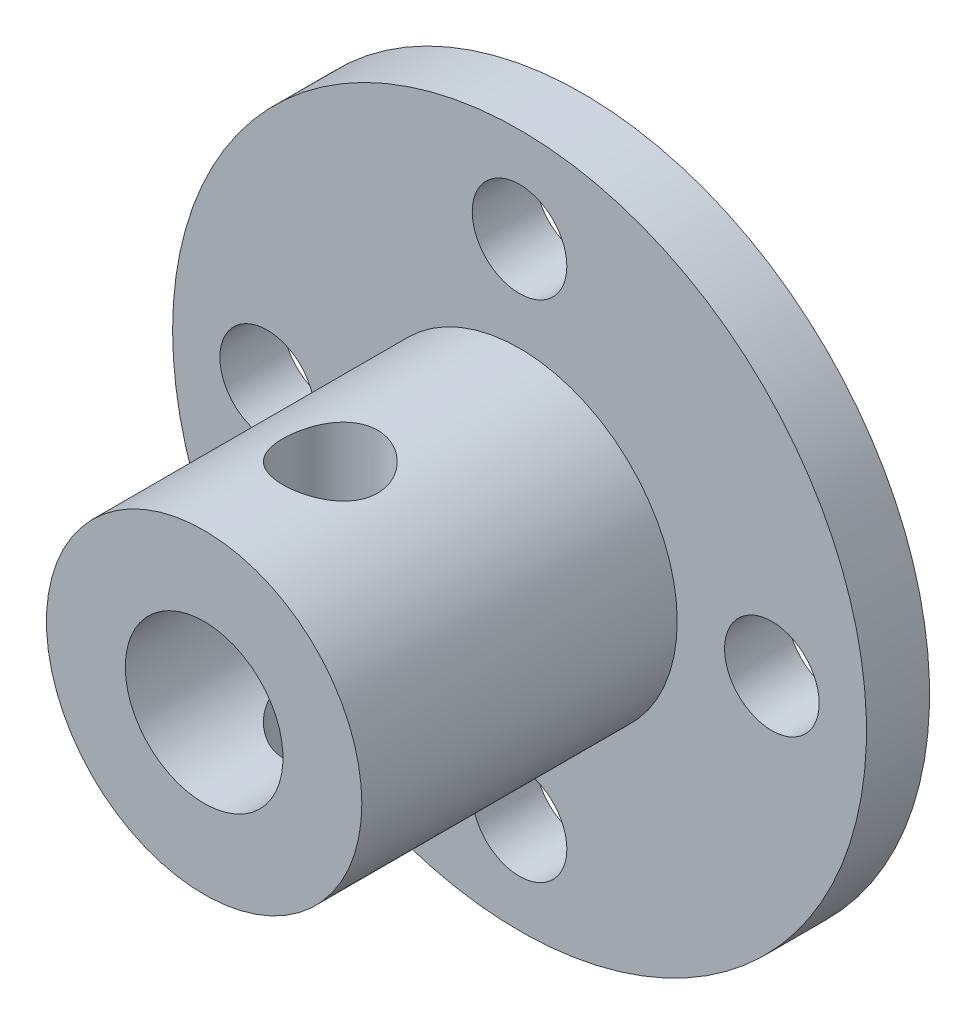
ISO-10303-21;
HEADER;
FILE_DESCRIPTION(('STEP AP214'),'2;1');
FILE_NAME('part.step','',(''),(''),'','','');
FILE_SCHEMA(('AUTOMOTIVE_DESIGN { 1 0 10303 214 1 1 1 1 }'));
ENDSEC;
DATA;
#1=APPLICATION_CONTEXT('core data for automotive mechanical design processes');
#2=APPLICATION_PROTOCOL_DEFINITION('international standard','automotive_design',2000,#1);
#3=PRODUCT_CONTEXT('',#1,'mechanical');
#4=PRODUCT('Part','Part','',(#3));
#5=PRODUCT_RELATED_PRODUCT_CATEGORY('part','',(#4));
#6=PRODUCT_DEFINITION_FORMATION('','',#4);
#7=PRODUCT_DEFINITION_CONTEXT('part definition',#1,'design');
#8=PRODUCT_DEFINITION('design','',#6,#7);
#9=PRODUCT_DEFINITION_SHAPE('','',#8);
#10=(LENGTH_UNIT() NAMED_UNIT(*) SI_UNIT(.MILLI.,.METRE.));
#11=(NAMED_UNIT(*) PLANE_ANGLE_UNIT() SI_UNIT($,.RADIAN.));
#12=(NAMED_UNIT(*) SI_UNIT($,.STERADIAN.) SOLID_ANGLE_UNIT());
#13=UNCERTAINTY_MEASURE_WITH_UNIT(LENGTH_MEASURE(1.E-05),#10,'distance_accuracy_value','');
#14=(GEOMETRIC_REPRESENTATION_CONTEXT(3) GLOBAL_UNCERTAINTY_ASSIGNED_CONTEXT((#13)) GLOBAL_UNIT_ASSIGNED_CONTEXT((#10,
#11,#12)) REPRESENTATION_CONTEXT('',''));
#15=CARTESIAN_POINT('',(0.,0.,0.));
#16=DIRECTION('',(0.,0.,1.));
#17=DIRECTION('',(1.,0.,0.));
#18=AXIS2_PLACEMENT_3D('',#15,#16,#17);
#19=CARTESIAN_POINT('',(0.,0.,2.));
#20=DIRECTION('',(0.,0.,-1.));
#21=DIRECTION('',(-1.,0.,0.));
#22=AXIS2_PLACEMENT_3D('',#19,#20,#21);
#23=CYLINDRICAL_SURFACE('',#22,11.);
#24=CARTESIAN_POINT('',(0.,0.,2.));
#25=DIRECTION('',(0.,0.,-1.));
#26=DIRECTION('',(-1.,0.,0.));
#27=AXIS2_PLACEMENT_3D('',#24,#25,#26);
#28=CIRCLE('',#27,11.);
#29=CARTESIAN_POINT('',(-11.,0.,2.));
#30=VERTEX_POINT('',#29);
#31=EDGE_CURVE('E51',#30,#30,#28,.T.);
#32=ORIENTED_EDGE('',*,*,#31,.T.);
#33=EDGE_LOOP('',(#32));
#34=FACE_BOUND('',#33,.T.);
#35=CARTESIAN_POINT('',(0.,0.,0.));
#36=DIRECTION('',(0.,0.,-1.));
#37=DIRECTION('',(-1.,0.,0.));
#38=AXIS2_PLACEMENT_3D('',#35,#36,#37);
#39=CIRCLE('',#38,11.);
#40=CARTESIAN_POINT('',(-11.,0.,0.));
#41=VERTEX_POINT('',#40);
#42=EDGE_CURVE('E56',#41,#41,#39,.T.);
#43=ORIENTED_EDGE('',*,*,#42,.F.);
#44=EDGE_LOOP('',(#43));
#45=FACE_BOUND('',#44,.T.);
#46=ADVANCED_FACE('F39',(#34,#45),#23,.T.);
#47=CARTESIAN_POINT('',(11.,0.,2.));
#48=DIRECTION('',(0.,0.,1.));
#49=DIRECTION('',(1.,0.,0.));
#50=AXIS2_PLACEMENT_3D('',#47,#48,#49);
#51=PLANE('',#50);
#52=CARTESIAN_POINT('',(0.,8.,2.));
#53=DIRECTION('',(0.,0.,1.));
#54=DIRECTION('',(1.,0.,0.));
#55=AXIS2_PLACEMENT_3D('',#52,#53,#54);
#56=CIRCLE('',#55,1.49999999999999);
#57=CARTESIAN_POINT('',(1.49999999999999,8.,2.));
#58=VERTEX_POINT('',#57);
#59=EDGE_CURVE('E114',#58,#58,#56,.T.);
#60=ORIENTED_EDGE('',*,*,#59,.F.);
#61=EDGE_LOOP('',(#60));
#62=FACE_BOUND('',#61,.T.);
#63=CARTESIAN_POINT('',(8.,0.,2.));
#64=DIRECTION('',(0.,0.,1.));
#65=DIRECTION('',(1.,0.,0.));
#66=AXIS2_PLACEMENT_3D('',#63,#64,#65);
#67=CIRCLE('',#66,1.49999999999999);
#68=CARTESIAN_POINT('',(9.49999999999999,0.,2.));
#69=VERTEX_POINT('',#68);
#70=EDGE_CURVE('E118',#69,#69,#67,.T.);
#71=ORIENTED_EDGE('',*,*,#70,.F.);
#72=EDGE_LOOP('',(#71));
#73=FACE_BOUND('',#72,.T.);
#74=CARTESIAN_POINT('',(0.,-8.,2.));
#75=DIRECTION('',(0.,0.,1.));
#76=DIRECTION('',(1.,0.,0.));
#77=AXIS2_PLACEMENT_3D('',#74,#75,#76);
#78=CIRCLE('',#77,1.49999999999999);
#79=CARTESIAN_POINT('',(1.49999999999999,-8.,2.));
#80=VERTEX_POINT('',#79);
#81=EDGE_CURVE('E122',#80,#80,#78,.T.);
#82=ORIENTED_EDGE('',*,*,#81,.F.);
#83=EDGE_LOOP('',(#82));
#84=FACE_BOUND('',#83,.T.);
#85=CARTESIAN_POINT('',(-8.,0.,2.));
#86=DIRECTION('',(0.,0.,1.));
#87=DIRECTION('',(1.,0.,0.));
#88=AXIS2_PLACEMENT_3D('',#85,#86,#87);
#89=CIRCLE('',#88,1.49999999999999);
#90=CARTESIAN_POINT('',(-6.50000000000001,0.,2.));
#91=VERTEX_POINT('',#90);
#92=EDGE_CURVE('E126',#91,#91,#89,.T.);
#93=ORIENTED_EDGE('',*,*,#92,.F.);
#94=EDGE_LOOP('',(#93));
#95=FACE_BOUND('',#94,.T.);
#96=CARTESIAN_POINT('',(0.,0.,2.));
#97=DIRECTION('',(0.,0.,1.));
#98=DIRECTION('',(1.,0.,0.));
#99=AXIS2_PLACEMENT_3D('',#96,#97,#98);
#100=CIRCLE('',#99,5.);
#101=CARTESIAN_POINT('',(5.,0.,2.));
#102=VERTEX_POINT('',#101);
#103=EDGE_CURVE('E10',#102,#102,#100,.T.);
#104=ORIENTED_EDGE('',*,*,#103,.F.);
#105=EDGE_LOOP('',(#104));
#106=FACE_BOUND('',#105,.T.);
#107=ORIENTED_EDGE('',*,*,#31,.F.);
#108=EDGE_LOOP('',(#107));
#109=FACE_BOUND('',#108,.T.);
#110=ADVANCED_FACE('F103',(#62,#73,#84,#95,#106,#109),#51,.T.);
#111=CARTESIAN_POINT('',(0.,0.,0.));
#112=DIRECTION('',(0.,0.,-1.));
#113=DIRECTION('',(-1.,0.,0.));
#114=AXIS2_PLACEMENT_3D('',#111,#112,#113);
#115=PLANE('',#114);
#116=CARTESIAN_POINT('',(0.,0.,0.));
#117=DIRECTION('',(0.,0.,-1.));
#118=DIRECTION('',(-1.,0.,0.));
#119=AXIS2_PLACEMENT_3D('',#116,#117,#118);
#120=CIRCLE('',#119,2.49999999999999);
#121=CARTESIAN_POINT('',(-2.49999999999999,0.,0.));
#122=VERTEX_POINT('',#121);
#123=EDGE_CURVE('E152',#122,#122,#120,.T.);
#124=ORIENTED_EDGE('',*,*,#123,.F.);
#125=EDGE_LOOP('',(#124));
#126=FACE_BOUND('',#125,.T.);
#127=CARTESIAN_POINT('',(0.,8.,0.));
#128=DIRECTION('',(0.,0.,-1.));
#129=DIRECTION('',(-1.,0.,0.));
#130=AXIS2_PLACEMENT_3D('',#127,#128,#129);
#131=CIRCLE('',#130,1.49999999999999);
#132=CARTESIAN_POINT('',(-1.49999999999999,8.,0.));
#133=VERTEX_POINT('',#132);
#134=EDGE_CURVE('E147',#133,#133,#131,.T.);
#135=ORIENTED_EDGE('',*,*,#134,.F.);
#136=EDGE_LOOP('',(#135));
#137=FACE_BOUND('',#136,.T.);
#138=CARTESIAN_POINT('',(8.,0.,0.));
#139=DIRECTION('',(0.,0.,-1.));
#140=DIRECTION('',(-1.,0.,0.));
#141=AXIS2_PLACEMENT_3D('',#138,#139,#140);
#142=CIRCLE('',#141,1.49999999999999);
#143=CARTESIAN_POINT('',(6.50000000000001,0.,0.));
#144=VERTEX_POINT('',#143);
#145=EDGE_CURVE('E143',#144,#144,#142,.T.);
#146=ORIENTED_EDGE('',*,*,#145,.F.);
#147=EDGE_LOOP('',(#146));
#148=FACE_BOUND('',#147,.T.);
#149=CARTESIAN_POINT('',(0.,-8.,0.));
#150=DIRECTION('',(0.,0.,-1.));
#151=DIRECTION('',(-1.,0.,0.));
#152=AXIS2_PLACEMENT_3D('',#149,#150,#151);
#153=CIRCLE('',#152,1.49999999999999);
#154=CARTESIAN_POINT('',(-1.49999999999999,-8.,0.));
#155=VERTEX_POINT('',#154);
#156=EDGE_CURVE('E139',#155,#155,#153,.T.);
#157=ORIENTED_EDGE('',*,*,#156,.F.);
#158=EDGE_LOOP('',(#157));
#159=FACE_BOUND('',#158,.T.);
#160=CARTESIAN_POINT('',(-8.,0.,0.));
#161=DIRECTION('',(0.,0.,-1.));
#162=DIRECTION('',(-1.,0.,0.));
#163=AXIS2_PLACEMENT_3D('',#160,#161,#162);
#164=CIRCLE('',#163,1.49999999999999);
#165=CARTESIAN_POINT('',(-9.49999999999999,0.,0.));
#166=VERTEX_POINT('',#165);
#167=EDGE_CURVE('E133',#166,#166,#164,.T.);
#168=ORIENTED_EDGE('',*,*,#167,.F.);
#169=EDGE_LOOP('',(#168));
#170=FACE_BOUND('',#169,.T.);
#171=ORIENTED_EDGE('',*,*,#42,.T.);
#172=EDGE_LOOP('',(#171));
#173=FACE_BOUND('',#172,.T.);
#174=ADVANCED_FACE('F98',(#126,#137,#148,#159,#170,#173),#115,.T.);
#175=CARTESIAN_POINT('',(0.,0.,12.));
#176=DIRECTION('',(0.,0.,-1.));
#177=DIRECTION('',(-1.,0.,0.));
#178=AXIS2_PLACEMENT_3D('',#175,#176,#177);
#179=CYLINDRICAL_SURFACE('',#178,5.);
#180=CARTESIAN_POINT('',(0.,5.,9.50000000000005));
#181=CARTESIAN_POINT('',(-0.0822886127533022,4.9999992925055,9.49999900251516));
#182=CARTESIAN_POINT('',(-0.164587318351534,4.99794915693954,9.49320613637608));
#183=CARTESIAN_POINT('',(-0.32678812530489,4.98997105593691,9.46627864577794));
#184=CARTESIAN_POINT('',(-0.406689504411431,4.98404193389692,9.4461400419767));
#185=CARTESIAN_POINT('',(-0.561732707754542,4.96895552501836,9.39325398308978));
#186=CARTESIAN_POINT('',(-0.636881364395391,4.95980300250425,9.3605251303811));
#187=CARTESIAN_POINT('',(-0.780624181053154,4.93922109237645,9.2834639069442));
#188=CARTESIAN_POINT('',(-0.849217467469693,4.92779140192066,9.23912999260462));
#189=CARTESIAN_POINT('',(-0.979871797183773,4.90350737192774,9.13877599252737));
#190=CARTESIAN_POINT('',(-1.04171807124437,4.89062383657036,9.08248337411412));
#191=CARTESIAN_POINT('',(-1.15524920923327,4.86505834210441,8.96039077008985));
#192=CARTESIAN_POINT('',(-1.20693236327444,4.85237641724501,8.89458918787507));
#193=CARTESIAN_POINT('',(-1.29980037723711,4.82834113993771,8.75352924696241));
#194=CARTESIAN_POINT('',(-1.34072309022217,4.81702406663874,8.67809153900929));
#195=CARTESIAN_POINT('',(-1.40921394774765,4.7974362039403,8.52101074576973));
#196=CARTESIAN_POINT('',(-1.43678529919978,4.78916468313309,8.43936915607204));
#197=CARTESIAN_POINT('',(-1.47701633682656,4.77690870838433,8.27460973386955));
#198=CARTESIAN_POINT('',(-1.49007196234682,4.77281069324532,8.19159725613607));
#199=CARTESIAN_POINT('',(-1.50213730614677,4.76902789749766,8.02446684378324));
#200=CARTESIAN_POINT('',(-1.50115042761083,4.7693420476057,7.94034918194091));
#201=CARTESIAN_POINT('',(-1.48546977199816,4.77424744067776,7.77661609139151));
#202=CARTESIAN_POINT('',(-1.4712720526269,4.77868388599139,7.69694774963775));
#203=CARTESIAN_POINT('',(-1.4303742042706,4.79108356228623,7.54118021372653));
#204=CARTESIAN_POINT('',(-1.40367284141645,4.79904714132349,7.46508137262565));
#205=CARTESIAN_POINT('',(-1.33816026653686,4.81772733074972,7.31739965033924));
#206=CARTESIAN_POINT('',(-1.29918816934647,4.82848016115951,7.24589291604472));
#207=CARTESIAN_POINT('',(-1.21035222588687,4.85150987000064,7.11026797798979));
#208=CARTESIAN_POINT('',(-1.16048574002592,4.8637871174699,7.0461515705862));
#209=CARTESIAN_POINT('',(-1.0488129076555,4.88911011297937,6.92431380923795));
#210=CARTESIAN_POINT('',(-0.986594907467006,4.90216654310497,6.8669713359703));
#211=CARTESIAN_POINT('',(-0.853263259313997,4.92712244063258,6.76344601593572));
#212=CARTESIAN_POINT('',(-0.782149051860916,4.9390218351841,6.71726387158554));
#213=CARTESIAN_POINT('',(-0.632355038342827,4.9604316006947,6.63714007753523));
#214=CARTESIAN_POINT('',(-0.553627749747972,4.96992543668314,6.6032824837501));
#215=CARTESIAN_POINT('',(-0.391245415603536,4.98533521832222,6.54940040990033));
#216=CARTESIAN_POINT('',(-0.307591751589596,4.99125216186999,6.52937207146747));
#217=CARTESIAN_POINT('',(-0.140952242668341,4.99868364643539,6.50434782210056));
#218=CARTESIAN_POINT('',(-0.0580500976011935,5.0003485041779,6.49883841419834));
#219=CARTESIAN_POINT('',(0.107499605823381,4.9995292324176,6.50156915571204));
#220=CARTESIAN_POINT('',(0.190147196690781,4.99704565677757,6.5098074696514));
#221=CARTESIAN_POINT('',(0.350903605309702,4.98830696987163,6.53938461111145));
#222=CARTESIAN_POINT('',(0.429072772614177,4.98213829799417,6.56042338758082));
#223=CARTESIAN_POINT('',(0.580754638954534,4.96674347841532,6.61464323277816));
#224=CARTESIAN_POINT('',(0.654266777025598,4.95751696321085,6.64782576103782));
#225=CARTESIAN_POINT('',(0.79643718946107,4.93669654351324,6.72625316548109));
#226=CARTESIAN_POINT('',(0.86494382619969,4.92505280829675,6.77175934094793));
#227=CARTESIAN_POINT('',(0.993523307980171,4.90073468764317,6.87322475405277));
#228=CARTESIAN_POINT('',(1.05359403235596,4.88806004431079,6.92918661188763));
#229=CARTESIAN_POINT('',(1.1658574455103,4.86253171869137,7.05238730836931));
#230=CARTESIAN_POINT('',(1.21768481231507,4.84968825033267,7.1199618757717));
#231=CARTESIAN_POINT('',(1.30928995072157,4.82576515238463,7.2631279390135));
#232=CARTESIAN_POINT('',(1.34906803829476,4.8146854765465,7.33871922455819));
#233=CARTESIAN_POINT('',(1.41517347127172,4.79567189615054,7.49553249125466));
#234=CARTESIAN_POINT('',(1.44156346937054,4.78772337843826,7.57672618653657));
#235=CARTESIAN_POINT('',(1.48021730815118,4.77591594362793,7.74268796893146));
#236=CARTESIAN_POINT('',(1.49248598978783,4.77205562508299,7.82745482078765));
#237=CARTESIAN_POINT('',(1.50221984485064,4.76899972496085,7.99436151837622));
#238=CARTESIAN_POINT('',(1.50028055308494,4.76961647442753,8.07646365101758));
#239=CARTESIAN_POINT('',(1.48307505444818,4.77499401288293,8.2391141033728));
#240=CARTESIAN_POINT('',(1.46780938124721,4.7797546359255,8.31966248517636));
#241=CARTESIAN_POINT('',(1.42476888804141,4.79275763670384,8.47594539914286));
#242=CARTESIAN_POINT('',(1.39715175507073,4.80095604545963,8.5517272873617));
#243=CARTESIAN_POINT('',(1.33031507121134,4.81990278909135,8.69764243881774));
#244=CARTESIAN_POINT('',(1.29109329962881,4.83065161194311,8.76777461764078));
#245=CARTESIAN_POINT('',(1.20048763805076,4.85397676425832,8.90316311652713));
#246=CARTESIAN_POINT('',(1.14871276092998,4.86660540163797,8.96814876126043));
#247=CARTESIAN_POINT('',(1.03517434629786,4.89201320450025,9.08870249830789));
#248=CARTESIAN_POINT('',(0.973408217134538,4.90479240823904,9.14426813946779));
#249=CARTESIAN_POINT('',(0.839465762183282,4.92950936570648,9.24602341229506));
#250=CARTESIAN_POINT('',(0.767037885790639,4.94141159765674,9.29189144685552));
#251=CARTESIAN_POINT('',(0.615141373983556,4.96260680455813,9.37073516990406));
#252=CARTESIAN_POINT('',(0.53567605299898,4.97190099931066,9.40371688827455));
#253=CARTESIAN_POINT('',(0.3807577126553,4.98602174969301,9.45289527565279));
#254=CARTESIAN_POINT('',(0.30578696195425,4.99122027381068,9.47051167288329));
#255=CARTESIAN_POINT('',(0.153880195230787,4.99820944494492,9.49406352524162));
#256=CARTESIAN_POINT('',(0.0769445098581436,5.0000006615474,9.50000093270487));
#257=CARTESIAN_POINT('',(0.,5.,9.50000000000005));
#258=B_SPLINE_CURVE_WITH_KNOTS('',3,(#180,#181,#182,#183,#184,#185,#186,#187,#188,#189,#190,
#191,#192,#193,#194,#195,#196,#197,#198,#199,#200,#201,#202,#203,#204,#205,#206,#207,#208,#209,
#210,#211,#212,#213,#214,#215,#216,#217,#218,#219,#220,#221,#222,#223,#224,#225,#226,#227,#228,
#229,#230,#231,#232,#233,#234,#235,#236,#237,#238,#239,#240,#241,#242,#243,#244,#245,#246,#247,
#248,#249,#250,#251,#252,#253,#254,#255,#256,#257),.UNSPECIFIED.,.T.,.F.,(4,2,2,2,2,2,2,2,2,2,2,
2,2,2,2,2,2,2,2,2,2,2,2,2,2,2,2,2,2,2,2,2,2,2,2,2,2,2,4),(0.,0.246583203612617,
0.493239964846013,0.739533676300895,0.98586016441273,1.23855602948195,1.49129437288637,
1.74971481004114,2.0080731454323,2.25919689356606,2.51025978319097,2.75226016697684,
2.9942844365801,3.23962426447129,3.48502360158566,3.74067104048178,3.99633456531083,
4.25371046881701,4.51101453528821,4.75908809438559,5.00712853550342,5.24956746682342,
5.49203554593745,5.74011305702925,5.98825282000209,6.24540400322837,6.502548442527,
6.75847814951272,7.01432009460303,7.25950155466964,7.50467319661622,7.74680040402744,
7.98897397553131,8.23996925679955,8.49102974897527,8.74942996156697,9.00770911595262,
9.23831691930487,9.46888616948904),.UNSPECIFIED.);
#259=CARTESIAN_POINT('',(0.,5.,9.50000000000005));
#260=VERTEX_POINT('',#259);
#261=EDGE_CURVE('E87',#260,#260,#258,.T.);
#262=ORIENTED_EDGE('',*,*,#261,.T.);
#263=EDGE_LOOP('',(#262));
#264=FACE_BOUND('',#263,.T.);
#265=CARTESIAN_POINT('',(0.,-5.,9.50000000000005));
#266=CARTESIAN_POINT('',(0.082288612753302,-4.9999992925055,9.49999900251516));
#267=CARTESIAN_POINT('',(0.164587318351534,-4.99794915693953,9.49320613637608));
#268=CARTESIAN_POINT('',(0.32678812530489,-4.98997105593691,9.46627864577794));
#269=CARTESIAN_POINT('',(0.406689504411431,-4.98404193389692,9.4461400419767));
#270=CARTESIAN_POINT('',(0.561732707754542,-4.96895552501836,9.39325398308978));
#271=CARTESIAN_POINT('',(0.636881364395391,-4.95980300250425,9.3605251303811));
#272=CARTESIAN_POINT('',(0.780624181053153,-4.93922109237645,9.2834639069442));
#273=CARTESIAN_POINT('',(0.849217467469693,-4.92779140192066,9.23912999260462));
#274=CARTESIAN_POINT('',(0.979871797183773,-4.90350737192773,9.13877599252737));
#275=CARTESIAN_POINT('',(1.04171807124437,-4.89062383657035,9.08248337411412));
#276=CARTESIAN_POINT('',(1.15524920923327,-4.86505834210441,8.96039077008985));
#277=CARTESIAN_POINT('',(1.20693236327444,-4.852376417245,8.89458918787507));
#278=CARTESIAN_POINT('',(1.29980037723711,-4.82834113993771,8.75352924696241));
#279=CARTESIAN_POINT('',(1.34072309022217,-4.81702406663873,8.67809153900929));
#280=CARTESIAN_POINT('',(1.40921394774765,-4.7974362039403,8.52101074576973));
#281=CARTESIAN_POINT('',(1.43678529919977,-4.78916468313309,8.43936915607204));
#282=CARTESIAN_POINT('',(1.47701633682656,-4.77690870838433,8.27460973386955));
#283=CARTESIAN_POINT('',(1.49007196234682,-4.77281069324532,8.19159725613607));
#284=CARTESIAN_POINT('',(1.50213730614676,-4.76902789749766,8.02446684378324));
#285=CARTESIAN_POINT('',(1.50115042761083,-4.7693420476057,7.94034918194091));
#286=CARTESIAN_POINT('',(1.48546977199816,-4.77424744067776,7.77661609139151));
#287=CARTESIAN_POINT('',(1.4712720526269,-4.77868388599139,7.69694774963775));
#288=CARTESIAN_POINT('',(1.4303742042706,-4.79108356228623,7.54118021372653));
#289=CARTESIAN_POINT('',(1.40367284141645,-4.79904714132349,7.46508137262565));
#290=CARTESIAN_POINT('',(1.33816026653686,-4.81772733074972,7.31739965033924));
#291=CARTESIAN_POINT('',(1.29918816934647,-4.82848016115951,7.24589291604472));
#292=CARTESIAN_POINT('',(1.21035222588687,-4.85150987000064,7.11026797798979));
#293=CARTESIAN_POINT('',(1.16048574002592,-4.8637871174699,7.0461515705862));
#294=CARTESIAN_POINT('',(1.0488129076555,-4.88911011297936,6.92431380923795));
#295=CARTESIAN_POINT('',(0.986594907467006,-4.90216654310497,6.8669713359703));
#296=CARTESIAN_POINT('',(0.853263259313997,-4.92712244063258,6.76344601593572));
#297=CARTESIAN_POINT('',(0.782149051860915,-4.93902183518409,6.71726387158554));
#298=CARTESIAN_POINT('',(0.632355038342826,-4.9604316006947,6.63714007753523));
#299=CARTESIAN_POINT('',(0.553627749747971,-4.96992543668314,6.6032824837501));
#300=CARTESIAN_POINT('',(0.391245415603535,-4.98533521832222,6.54940040990033));
#301=CARTESIAN_POINT('',(0.307591751589594,-4.99125216186999,6.52937207146747));
#302=CARTESIAN_POINT('',(0.14095224266834,-4.99868364643538,6.50434782210056));
#303=CARTESIAN_POINT('',(0.0580500976011924,-5.0003485041779,6.49883841419834));
#304=CARTESIAN_POINT('',(-0.107499605823382,-4.99952923241759,6.50156915571204));
#305=CARTESIAN_POINT('',(-0.190147196690782,-4.99704565677756,6.5098074696514));
#306=CARTESIAN_POINT('',(-0.350903605309703,-4.98830696987163,6.53938461111145));
#307=CARTESIAN_POINT('',(-0.429072772614178,-4.98213829799417,6.56042338758083));
#308=CARTESIAN_POINT('',(-0.580754638954535,-4.96674347841532,6.61464323277816));
#309=CARTESIAN_POINT('',(-0.654266777025599,-4.95751696321084,6.64782576103782));
#310=CARTESIAN_POINT('',(-0.796437189461071,-4.93669654351324,6.72625316548109));
#311=CARTESIAN_POINT('',(-0.864943826199691,-4.92505280829674,6.77175934094793));
#312=CARTESIAN_POINT('',(-0.993523307980172,-4.90073468764317,6.87322475405277));
#313=CARTESIAN_POINT('',(-1.05359403235596,-4.88806004431079,6.92918661188763));
#314=CARTESIAN_POINT('',(-1.1658574455103,-4.86253171869137,7.05238730836931));
#315=CARTESIAN_POINT('',(-1.21768481231507,-4.84968825033267,7.1199618757717));
#316=CARTESIAN_POINT('',(-1.30928995072157,-4.82576515238462,7.2631279390135));
#317=CARTESIAN_POINT('',(-1.34906803829476,-4.8146854765465,7.33871922455819));
#318=CARTESIAN_POINT('',(-1.41517347127172,-4.79567189615054,7.49553249125467));
#319=CARTESIAN_POINT('',(-1.44156346937054,-4.78772337843826,7.57672618653657));
#320=CARTESIAN_POINT('',(-1.48021730815119,-4.77591594362793,7.74268796893146));
#321=CARTESIAN_POINT('',(-1.49248598978784,-4.77205562508299,7.82745482078766));
#322=CARTESIAN_POINT('',(-1.50221984485064,-4.76899972496085,7.99436151837622));
#323=CARTESIAN_POINT('',(-1.50028055308495,-4.76961647442753,8.07646365101758));
#324=CARTESIAN_POINT('',(-1.48307505444818,-4.77499401288293,8.2391141033728));
#325=CARTESIAN_POINT('',(-1.46780938124721,-4.7797546359255,8.31966248517636));
#326=CARTESIAN_POINT('',(-1.42476888804141,-4.79275763670384,8.47594539914286));
#327=CARTESIAN_POINT('',(-1.39715175507073,-4.80095604545963,8.5517272873617));
#328=CARTESIAN_POINT('',(-1.33031507121134,-4.81990278909135,8.69764243881774));
#329=CARTESIAN_POINT('',(-1.29109329962881,-4.83065161194311,8.76777461764078));
#330=CARTESIAN_POINT('',(-1.20048763805076,-4.85397676425832,8.90316311652713));
#331=CARTESIAN_POINT('',(-1.14871276092998,-4.86660540163796,8.96814876126043));
#332=CARTESIAN_POINT('',(-1.03517434629786,-4.89201320450025,9.08870249830789));
#333=CARTESIAN_POINT('',(-0.973408217134538,-4.90479240823904,9.14426813946779));
#334=CARTESIAN_POINT('',(-0.839465762183282,-4.92950936570648,9.24602341229506));
#335=CARTESIAN_POINT('',(-0.767037885790639,-4.94141159765674,9.29189144685552));
#336=CARTESIAN_POINT('',(-0.615141373983556,-4.96260680455813,9.37073516990406));
#337=CARTESIAN_POINT('',(-0.535676052998979,-4.97190099931066,9.40371688827455));
#338=CARTESIAN_POINT('',(-0.3807577126553,-4.98602174969301,9.45289527565279));
#339=CARTESIAN_POINT('',(-0.30578696195425,-4.99122027381067,9.47051167288329));
#340=CARTESIAN_POINT('',(-0.153880195230788,-4.99820944494492,9.49406352524162));
#341=CARTESIAN_POINT('',(-0.0769445098581438,-5.0000006615474,9.50000093270487));
#342=CARTESIAN_POINT('',(0.,-5.,9.50000000000005));
#343=B_SPLINE_CURVE_WITH_KNOTS('',3,(#265,#266,#267,#268,#269,#270,#271,#272,#273,#274,#275,
#276,#277,#278,#279,#280,#281,#282,#283,#284,#285,#286,#287,#288,#289,#290,#291,#292,#293,#294,
#295,#296,#297,#298,#299,#300,#301,#302,#303,#304,#305,#306,#307,#308,#309,#310,#311,#312,#313,
#314,#315,#316,#317,#318,#319,#320,#321,#322,#323,#324,#325,#326,#327,#328,#329,#330,#331,#332,
#333,#334,#335,#336,#337,#338,#339,#340,#341,#342),.UNSPECIFIED.,.T.,.F.,(4,2,2,2,2,2,2,2,2,2,2,
2,2,2,2,2,2,2,2,2,2,2,2,2,2,2,2,2,2,2,2,2,2,2,2,2,2,2,4),(0.,0.246583203612617,
0.493239964846013,0.739533676300895,0.98586016441273,1.23855602948195,1.49129437288637,
1.74971481004114,2.0080731454323,2.25919689356606,2.51025978319097,2.75226016697684,
2.9942844365801,3.23962426447129,3.48502360158566,3.74067104048178,3.99633456531083,
4.25371046881701,4.51101453528821,4.75908809438559,5.00712853550342,5.24956746682342,
5.49203554593745,5.74011305702925,5.98825282000209,6.24540400322837,6.502548442527,
6.75847814951272,7.01432009460304,7.25950155466964,7.50467319661622,7.74680040402744,
7.98897397553131,8.23996925679955,8.49102974897527,8.74942996156697,9.00770911595262,
9.23831691930487,9.46888616948903),.UNSPECIFIED.);
#344=CARTESIAN_POINT('',(0.,-5.,9.50000000000005));
#345=VERTEX_POINT('',#344);
#346=EDGE_CURVE('E68',#345,#345,#343,.T.);
#347=ORIENTED_EDGE('',*,*,#346,.T.);
#348=EDGE_LOOP('',(#347));
#349=FACE_BOUND('',#348,.T.);
#350=CARTESIAN_POINT('',(0.,0.,12.));
#351=DIRECTION('',(0.,0.,1.));
#352=DIRECTION('',(1.,0.,0.));
#353=AXIS2_PLACEMENT_3D('',#350,#351,#352);
#354=CIRCLE('',#353,5.);
#355=CARTESIAN_POINT('',(5.,0.,12.));
#356=VERTEX_POINT('',#355);
#357=EDGE_CURVE('E60',#356,#356,#354,.T.);
#358=ORIENTED_EDGE('',*,*,#357,.F.);
#359=EDGE_LOOP('',(#358));
#360=FACE_BOUND('',#359,.T.);
#361=ORIENTED_EDGE('',*,*,#103,.T.);
#362=EDGE_LOOP('',(#361));
#363=FACE_BOUND('',#362,.T.);
#364=ADVANCED_FACE('F92',(#264,#349,#360,#363),#179,.T.);
#365=CARTESIAN_POINT('',(0.,0.,12.));
#366=DIRECTION('',(0.,0.,1.));
#367=DIRECTION('',(1.,0.,0.));
#368=AXIS2_PLACEMENT_3D('',#365,#366,#367);
#369=PLANE('',#368);
#370=CARTESIAN_POINT('',(0.,0.,12.));
#371=DIRECTION('',(0.,0.,-1.));
#372=DIRECTION('',(-1.,0.,0.));
#373=AXIS2_PLACEMENT_3D('',#370,#371,#372);
#374=CIRCLE('',#373,2.49999999999999);
#375=CARTESIAN_POINT('',(-2.49999999999999,0.,12.));
#376=VERTEX_POINT('',#375);
#377=EDGE_CURVE('E150',#376,#376,#374,.T.);
#378=ORIENTED_EDGE('',*,*,#377,.T.);
#379=EDGE_LOOP('',(#378));
#380=FACE_BOUND('',#379,.T.);
#381=ORIENTED_EDGE('',*,*,#357,.T.);
#382=EDGE_LOOP('',(#381));
#383=FACE_BOUND('',#382,.T.);
#384=ADVANCED_FACE('F97',(#380,#383),#369,.T.);
#385=CARTESIAN_POINT('',(-8.,0.,0.));
#386=DIRECTION('',(0.,0.,-1.));
#387=DIRECTION('',(-1.,0.,0.));
#388=AXIS2_PLACEMENT_3D('',#385,#386,#387);
#389=CYLINDRICAL_SURFACE('',#388,1.49999999999999);
#390=ORIENTED_EDGE('',*,*,#92,.T.);
#391=EDGE_LOOP('',(#390));
#392=FACE_BOUND('',#391,.T.);
#393=ORIENTED_EDGE('',*,*,#167,.T.);
#394=EDGE_LOOP('',(#393));
#395=FACE_BOUND('',#394,.T.);
#396=ADVANCED_FACE('F173',(#392,#395),#389,.F.);
#397=CARTESIAN_POINT('',(0.,-8.,0.));
#398=DIRECTION('',(0.,0.,-1.));
#399=DIRECTION('',(-1.,0.,0.));
#400=AXIS2_PLACEMENT_3D('',#397,#398,#399);
#401=CYLINDRICAL_SURFACE('',#400,1.49999999999999);
#402=ORIENTED_EDGE('',*,*,#81,.T.);
#403=EDGE_LOOP('',(#402));
#404=FACE_BOUND('',#403,.T.);
#405=ORIENTED_EDGE('',*,*,#156,.T.);
#406=EDGE_LOOP('',(#405));
#407=FACE_BOUND('',#406,.T.);
#408=ADVANCED_FACE('F178',(#404,#407),#401,.F.);
#409=CARTESIAN_POINT('',(8.,0.,0.));
#410=DIRECTION('',(0.,0.,-1.));
#411=DIRECTION('',(-1.,0.,0.));
#412=AXIS2_PLACEMENT_3D('',#409,#410,#411);
#413=CYLINDRICAL_SURFACE('',#412,1.49999999999999);
#414=ORIENTED_EDGE('',*,*,#70,.T.);
#415=EDGE_LOOP('',(#414));
#416=FACE_BOUND('',#415,.T.);
#417=ORIENTED_EDGE('',*,*,#145,.T.);
#418=EDGE_LOOP('',(#417));
#419=FACE_BOUND('',#418,.T.);
#420=ADVANCED_FACE('F186',(#416,#419),#413,.F.);
#421=CARTESIAN_POINT('',(0.,8.,0.));
#422=DIRECTION('',(0.,0.,-1.));
#423=DIRECTION('',(-1.,0.,0.));
#424=AXIS2_PLACEMENT_3D('',#421,#422,#423);
#425=CYLINDRICAL_SURFACE('',#424,1.49999999999999);
#426=ORIENTED_EDGE('',*,*,#59,.T.);
#427=EDGE_LOOP('',(#426));
#428=FACE_BOUND('',#427,.T.);
#429=ORIENTED_EDGE('',*,*,#134,.T.);
#430=EDGE_LOOP('',(#429));
#431=FACE_BOUND('',#430,.T.);
#432=ADVANCED_FACE('F182',(#428,#431),#425,.F.);
#433=CARTESIAN_POINT('',(0.,0.,0.));
#434=DIRECTION('',(0.,0.,-1.));
#435=DIRECTION('',(-1.,0.,0.));
#436=AXIS2_PLACEMENT_3D('',#433,#434,#435);
#437=CYLINDRICAL_SURFACE('',#436,2.49999999999999);
#438=CARTESIAN_POINT('',(0.,-2.49999999999999,9.50000000000005));
#439=CARTESIAN_POINT('',(-0.0767298334620178,-2.49999625789731,9.49999590899017));
#440=CARTESIAN_POINT('',(-0.153582320644182,-2.49642904615008,9.49407132907378));
#441=CARTESIAN_POINT('',(-0.304975509530686,-2.48249903608566,9.47067568048472));
#442=CARTESIAN_POINT('',(-0.379510034596056,-2.47211948032717,9.45317613814582));
#443=CARTESIAN_POINT('',(-0.52375182779085,-2.44561558054486,9.40761363883319));
#444=CARTESIAN_POINT('',(-0.593481028226581,-2.42951973272942,9.37960304183689));
#445=CARTESIAN_POINT('',(-0.727030318214677,-2.39295367626405,9.31413966685901));
#446=CARTESIAN_POINT('',(-0.790851869416403,-2.37248455380253,9.27668923303129));
#447=CARTESIAN_POINT('',(-0.916299278999338,-2.32705360719085,9.19022517329146));
#448=CARTESIAN_POINT('',(-0.97738402008144,-2.30186792195982,9.14054630464865));
#449=CARTESIAN_POINT('',(-1.09088270411894,-2.25030439279631,9.03253279617176));
#450=CARTESIAN_POINT('',(-1.14328534948115,-2.22392505153568,8.97418706281272));
#451=CARTESIAN_POINT('',(-1.24444996762977,-2.16911066995907,8.8420764895033));
#452=CARTESIAN_POINT('',(-1.29197766378812,-2.14082017703645,8.76729822901874));
#453=CARTESIAN_POINT('',(-1.373614377649,-2.0893830141212,8.60915342675691));
#454=CARTESIAN_POINT('',(-1.40774517335164,-2.06622802273933,8.52580110375246));
#455=CARTESIAN_POINT('',(-1.45440601714226,-2.03354629660925,8.37340354934678));
#456=CARTESIAN_POINT('',(-1.47016197246831,-2.02207883137586,8.3057640013897));
#457=CARTESIAN_POINT('',(-1.49216172340479,-2.00590308295498,8.16819628416965));
#458=CARTESIAN_POINT('',(-1.4984173455684,-2.00118639643754,8.09827107124552));
#459=CARTESIAN_POINT('',(-1.50105508796013,-1.99920922463851,7.95798850578268));
#460=CARTESIAN_POINT('',(-1.49741783408423,-2.00196337012712,7.88763057490682));
#461=CARTESIAN_POINT('',(-1.48046060478832,-2.01453261443736,7.74872122457242));
#462=CARTESIAN_POINT('',(-1.46713334620108,-2.02435302432221,7.68017120415257));
#463=CARTESIAN_POINT('',(-1.43173921881797,-2.04953186944253,7.5474697578719));
#464=CARTESIAN_POINT('',(-1.40978748666092,-2.06481711652532,7.48327294607552));
#465=CARTESIAN_POINT('',(-1.35795061770842,-2.09927051350823,7.35930500907188));
#466=CARTESIAN_POINT('',(-1.3280625725971,-2.1184400862346,7.29953551657608));
#467=CARTESIAN_POINT('',(-1.25517983184588,-2.1625532726898,7.1750159028772));
#468=CARTESIAN_POINT('',(-1.21080724397728,-2.18792043372987,7.11122190704507));
#469=CARTESIAN_POINT('',(-1.11291092784009,-2.23930599764377,6.99132351633298));
#470=CARTESIAN_POINT('',(-1.05937845100584,-2.26532500262145,6.93522656602349));
#471=CARTESIAN_POINT('',(-0.935811834383023,-2.31935504958313,6.82438701817823));
#472=CARTESIAN_POINT('',(-0.864517682705013,-2.34713836268529,6.77092269398399));
#473=CARTESIAN_POINT('',(-0.712276050459054,-2.39772428433977,6.67687795280207));
#474=CARTESIAN_POINT('',(-0.631333763943616,-2.42052955425512,6.63629064621002));
#475=CARTESIAN_POINT('',(-0.467197585268254,-2.45730392066149,6.57206781720407));
#476=CARTESIAN_POINT('',(-0.384467624173625,-2.47173957439701,6.54752464428405));
#477=CARTESIAN_POINT('',(-0.215047895144678,-2.49218842813549,6.51298880259458));
#478=CARTESIAN_POINT('',(-0.128363005661354,-2.49821172952736,6.50297868224638));
#479=CARTESIAN_POINT('',(0.0337146143773666,-2.50090570374609,6.49849215232164));
#480=CARTESIAN_POINT('',(0.10904247341869,-2.49873521714284,6.50209114491478));
#481=CARTESIAN_POINT('',(0.257829401986038,-2.48778712087047,6.52042585307187));
#482=CARTESIAN_POINT('',(0.331288509376085,-2.47900964518036,6.53516134280576));
#483=CARTESIAN_POINT('',(0.472574932157597,-2.45594792442189,6.57454343281241));
#484=CARTESIAN_POINT('',(0.54049575092847,-2.44180275662554,6.59894034907341));
#485=CARTESIAN_POINT('',(0.671265749087252,-2.40913880862843,6.65667737636521));
#486=CARTESIAN_POINT('',(0.7341139249639,-2.3906191658651,6.69001925134662));
#487=CARTESIAN_POINT('',(0.860006262823859,-2.34845496237359,6.76855697920865));
#488=CARTESIAN_POINT('',(0.922394150456835,-2.32447802739878,6.81462382907833));
#489=CARTESIAN_POINT('',(1.03902603131014,-2.2747426557473,6.91539139348856));
#490=CARTESIAN_POINT('',(1.09326040273739,-2.24898216586359,6.97010215485247));
#491=CARTESIAN_POINT('',(1.1993199673558,-2.19445423909889,7.09491039003709));
#492=CARTESIAN_POINT('',(1.24991019630916,-2.16573241746289,7.16608388546544));
#493=CARTESIAN_POINT('',(1.33845238915669,-2.11216182066707,7.31721602456814));
#494=CARTESIAN_POINT('',(1.37641766769783,-2.08730897997687,7.39716529389272));
#495=CARTESIAN_POINT('',(1.43142578795779,-2.04984909240516,7.54624302230663));
#496=CARTESIAN_POINT('',(1.45121625336193,-2.03575659328725,7.61398031235853));
#497=CARTESIAN_POINT('',(1.48113663905975,-2.01409605743539,7.75253207808005));
#498=CARTESIAN_POINT('',(1.49127995297634,-2.00651897642716,7.82334214432778));
#499=CARTESIAN_POINT('',(1.50134130416636,-1.99900446616262,7.96637694759698));
#500=CARTESIAN_POINT('',(1.50122089107874,-1.99909576445932,8.038605990687));
#501=CARTESIAN_POINT('',(1.49066472959333,-2.00697717892845,8.18189443560942));
#502=CARTESIAN_POINT('',(1.48022337215764,-2.01477148138815,8.25295318008056));
#503=CARTESIAN_POINT('',(1.45040174148918,-2.03633185242974,8.38848841757215));
#504=CARTESIAN_POINT('',(1.43147636845357,-2.04979211805575,8.45311709430684));
#505=CARTESIAN_POINT('',(1.38563242076999,-2.08105501960146,8.57833725447418));
#506=CARTESIAN_POINT('',(1.35871083588486,-2.09885929040476,8.63892720696052));
#507=CARTESIAN_POINT('',(1.29289245555739,-2.14012990550911,8.76431985722075));
#508=CARTESIAN_POINT('',(1.2527916767576,-2.16404587582634,8.82834110385428));
#509=CARTESIAN_POINT('',(1.16375698389092,-2.21320127030762,8.94938007261727));
#510=CARTESIAN_POINT('',(1.11481579607806,-2.23844177205016,9.00639196215254));
#511=CARTESIAN_POINT('',(1.00009777425742,-2.29225690291471,9.12135094913166));
#512=CARTESIAN_POINT('',(0.932876819313988,-2.32070308663653,9.17793107489618));
#513=CARTESIAN_POINT('',(0.788462434445675,-2.37365428872363,9.27909785586331));
#514=CARTESIAN_POINT('',(0.711265444501626,-2.39815789310932,9.3236802119848));
#515=CARTESIAN_POINT('',(0.551125230801538,-2.43985578654391,9.39778580757375));
#516=CARTESIAN_POINT('',(0.468430086957297,-2.45725077479784,9.42772806492685));
#517=CARTESIAN_POINT('',(0.297973306118885,-2.48366273001243,9.47272469521101));
#518=CARTESIAN_POINT('',(0.210232099648685,-2.49271125871483,9.48783516785703));
#519=CARTESIAN_POINT('',(0.101558096917594,-2.49802001168185,9.4966974547087));
#520=CARTESIAN_POINT('',(0.0812762590283234,-2.4987611465636,9.49793441730614));
#521=CARTESIAN_POINT('',(0.0406658206871352,-2.49975164517365,9.49958624637091));
#522=CARTESIAN_POINT('',(0.0203372186375808,-2.50000099184314,9.50000108432095));
#523=CARTESIAN_POINT('',(0.,-2.49999999999999,9.50000000000005));
#524=B_SPLINE_CURVE_WITH_KNOTS('',3,(#438,#439,#440,#441,#442,#443,#444,#445,#446,#447,#448,
#449,#450,#451,#452,#453,#454,#455,#456,#457,#458,#459,#460,#461,#462,#463,#464,#465,#466,#467,
#468,#469,#470,#471,#472,#473,#474,#475,#476,#477,#478,#479,#480,#481,#482,#483,#484,#485,#486,
#487,#488,#489,#490,#491,#492,#493,#494,#495,#496,#497,#498,#499,#500,#501,#502,#503,#504,#505,
#506,#507,#508,#509,#510,#511,#512,#513,#514,#515,#516,#517,#518,#519,#520,#521,#522,#523),
.UNSPECIFIED.,.T.,.F.,(4,2,2,2,2,2,2,2,2,2,2,2,2,2,2,2,2,2,2,2,2,2,2,2,2,2,2,2,2,2,2,2,2,2,2,2,
2,2,2,2,2,2,4),(0.,0.230102237548654,0.460772627520023,0.69030888460003,0.919788197992298,
1.16681590732475,1.41416257934804,1.69183813189812,1.96906040692097,2.17933829855639,
2.38935420916584,2.59978170870732,2.81036753273879,3.01823267593214,3.22617409809876,
3.4704699522517,3.71500044803682,3.993609578847,4.27206939275334,4.53296790696571,
4.79355286918248,5.01875602722439,5.24395461863469,5.46367785689786,5.6834444565904,
5.92601365818377,6.16886690081851,6.44336762428025,6.71757792616473,6.9325778731471,
7.14727888733337,7.36278425777452,7.57840681155744,7.78364098331161,7.98895251523055,
8.22578610052306,8.46281544370228,8.73854311775539,9.01436946032007,9.281756544627,
9.54812832184473,9.60911473335205,9.67010326027672),.UNSPECIFIED.);
#525=CARTESIAN_POINT('',(0.,-2.49999999999999,9.50000000000005));
#526=VERTEX_POINT('',#525);
#527=EDGE_CURVE('E42',#526,#526,#524,.T.);
#528=ORIENTED_EDGE('',*,*,#527,.T.);
#529=EDGE_LOOP('',(#528));
#530=FACE_BOUND('',#529,.T.);
#531=CARTESIAN_POINT('',(0.,2.49999999999999,9.50000000000005));
#532=CARTESIAN_POINT('',(0.0767298334620175,2.49999625789731,9.49999590899017));
#533=CARTESIAN_POINT('',(0.153582320644181,2.49642904615009,9.49407132907378));
#534=CARTESIAN_POINT('',(0.304975509530686,2.48249903608566,9.47067568048472));
#535=CARTESIAN_POINT('',(0.379510034596056,2.47211948032717,9.45317613814582));
#536=CARTESIAN_POINT('',(0.52375182779085,2.44561558054487,9.40761363883319));
#537=CARTESIAN_POINT('',(0.593481028226581,2.42951973272942,9.37960304183689));
#538=CARTESIAN_POINT('',(0.727030318214677,2.39295367626406,9.31413966685901));
#539=CARTESIAN_POINT('',(0.790851869416402,2.37248455380253,9.27668923303129));
#540=CARTESIAN_POINT('',(0.916299278999337,2.32705360719085,9.19022517329146));
#541=CARTESIAN_POINT('',(0.977384020081439,2.30186792195983,9.14054630464865));
#542=CARTESIAN_POINT('',(1.09088270411894,2.25030439279631,9.03253279617176));
#543=CARTESIAN_POINT('',(1.14328534948115,2.22392505153568,8.97418706281272));
#544=CARTESIAN_POINT('',(1.24444996762977,2.16911066995907,8.8420764895033));
#545=CARTESIAN_POINT('',(1.29197766378812,2.14082017703646,8.76729822901875));
#546=CARTESIAN_POINT('',(1.373614377649,2.0893830141212,8.60915342675691));
#547=CARTESIAN_POINT('',(1.40774517335163,2.06622802273934,8.52580110375246));
#548=CARTESIAN_POINT('',(1.45440601714226,2.03354629660926,8.37340354934678));
#549=CARTESIAN_POINT('',(1.47016197246831,2.02207883137587,8.3057640013897));
#550=CARTESIAN_POINT('',(1.49216172340479,2.00590308295498,8.16819628416965));
#551=CARTESIAN_POINT('',(1.4984173455684,2.00118639643755,8.09827107124552));
#552=CARTESIAN_POINT('',(1.50105508796013,1.99920922463851,7.95798850578268));
#553=CARTESIAN_POINT('',(1.49741783408423,2.00196337012713,7.88763057490682));
#554=CARTESIAN_POINT('',(1.48046060478832,2.01453261443736,7.74872122457243));
#555=CARTESIAN_POINT('',(1.46713334620108,2.02435302432221,7.68017120415257));
#556=CARTESIAN_POINT('',(1.43173921881797,2.04953186944253,7.5474697578719));
#557=CARTESIAN_POINT('',(1.40978748666092,2.06481711652532,7.48327294607552));
#558=CARTESIAN_POINT('',(1.35795061770842,2.09927051350824,7.35930500907188));
#559=CARTESIAN_POINT('',(1.3280625725971,2.1184400862346,7.29953551657608));
#560=CARTESIAN_POINT('',(1.25517983184588,2.16255327268981,7.1750159028772));
#561=CARTESIAN_POINT('',(1.21080724397728,2.18792043372988,7.11122190704507));
#562=CARTESIAN_POINT('',(1.11291092784009,2.23930599764377,6.99132351633298));
#563=CARTESIAN_POINT('',(1.05937845100584,2.26532500262145,6.93522656602349));
#564=CARTESIAN_POINT('',(0.935811834383024,2.31935504958313,6.82438701817823));
#565=CARTESIAN_POINT('',(0.864517682705014,2.34713836268529,6.77092269398399));
#566=CARTESIAN_POINT('',(0.712276050459055,2.39772428433978,6.67687795280207));
#567=CARTESIAN_POINT('',(0.631333763943617,2.42052955425513,6.63629064621002));
#568=CARTESIAN_POINT('',(0.467197585268254,2.45730392066149,6.57206781720407));
#569=CARTESIAN_POINT('',(0.384467624173626,2.47173957439702,6.54752464428405));
#570=CARTESIAN_POINT('',(0.215047895144679,2.49218842813549,6.51298880259458));
#571=CARTESIAN_POINT('',(0.128363005661356,2.49821172952736,6.50297868224638));
#572=CARTESIAN_POINT('',(-0.0337146143773654,2.50090570374609,6.49849215232164));
#573=CARTESIAN_POINT('',(-0.109042473418689,2.49873521714285,6.50209114491478));
#574=CARTESIAN_POINT('',(-0.257829401986037,2.48778712087048,6.52042585307187));
#575=CARTESIAN_POINT('',(-0.331288509376085,2.47900964518037,6.53516134280576));
#576=CARTESIAN_POINT('',(-0.472574932157596,2.4559479244219,6.57454343281241));
#577=CARTESIAN_POINT('',(-0.540495750928468,2.44180275662554,6.59894034907341));
#578=CARTESIAN_POINT('',(-0.671265749087251,2.40913880862844,6.65667737636521));
#579=CARTESIAN_POINT('',(-0.734113924963899,2.3906191658651,6.69001925134661));
#580=CARTESIAN_POINT('',(-0.860006262823859,2.34845496237359,6.76855697920865));
#581=CARTESIAN_POINT('',(-0.922394150456834,2.32447802739879,6.81462382907833));
#582=CARTESIAN_POINT('',(-1.03902603131014,2.2747426557473,6.91539139348856));
#583=CARTESIAN_POINT('',(-1.09326040273738,2.24898216586359,6.97010215485247));
#584=CARTESIAN_POINT('',(-1.1993199673558,2.19445423909889,7.09491039003709));
#585=CARTESIAN_POINT('',(-1.24991019630916,2.16573241746289,7.16608388546544));
#586=CARTESIAN_POINT('',(-1.33845238915669,2.11216182066707,7.31721602456814));
#587=CARTESIAN_POINT('',(-1.37641766769783,2.08730897997687,7.39716529389272));
#588=CARTESIAN_POINT('',(-1.43142578795779,2.04984909240516,7.54624302230663));
#589=CARTESIAN_POINT('',(-1.45121625336193,2.03575659328725,7.61398031235853));
#590=CARTESIAN_POINT('',(-1.48113663905975,2.0140960574354,7.75253207808005));
#591=CARTESIAN_POINT('',(-1.49127995297634,2.00651897642716,7.82334214432778));
#592=CARTESIAN_POINT('',(-1.50134130416636,1.99900446616263,7.96637694759698));
#593=CARTESIAN_POINT('',(-1.50122089107874,1.99909576445932,8.038605990687));
#594=CARTESIAN_POINT('',(-1.49066472959333,2.00697717892845,8.18189443560942));
#595=CARTESIAN_POINT('',(-1.48022337215764,2.01477148138815,8.25295318008056));
#596=CARTESIAN_POINT('',(-1.45040174148918,2.03633185242975,8.38848841757215));
#597=CARTESIAN_POINT('',(-1.43147636845357,2.04979211805575,8.45311709430684));
#598=CARTESIAN_POINT('',(-1.38563242076999,2.08105501960146,8.57833725447419));
#599=CARTESIAN_POINT('',(-1.35871083588486,2.09885929040477,8.63892720696052));
#600=CARTESIAN_POINT('',(-1.29289245555739,2.14012990550911,8.76431985722075));
#601=CARTESIAN_POINT('',(-1.2527916767576,2.16404587582634,8.82834110385428));
#602=CARTESIAN_POINT('',(-1.16375698389092,2.21320127030762,8.94938007261727));
#603=CARTESIAN_POINT('',(-1.11481579607806,2.23844177205016,9.00639196215254));
#604=CARTESIAN_POINT('',(-1.00009777425742,2.29225690291472,9.12135094913166));
#605=CARTESIAN_POINT('',(-0.932876819313987,2.32070308663653,9.17793107489618));
#606=CARTESIAN_POINT('',(-0.788462434445673,2.37365428872363,9.27909785586331));
#607=CARTESIAN_POINT('',(-0.711265444501625,2.39815789310932,9.3236802119848));
#608=CARTESIAN_POINT('',(-0.551125230801537,2.43985578654391,9.39778580757375));
#609=CARTESIAN_POINT('',(-0.468430086957294,2.45725077479784,9.42772806492685));
#610=CARTESIAN_POINT('',(-0.297973306118882,2.48366273001244,9.472724695211));
#611=CARTESIAN_POINT('',(-0.210232099648683,2.49271125871483,9.48783516785702));
#612=CARTESIAN_POINT('',(-0.101558096917592,2.49802001168185,9.4966974547087));
#613=CARTESIAN_POINT('',(-0.0812762590283221,2.4987611465636,9.49793441730614));
#614=CARTESIAN_POINT('',(-0.0406658206871348,2.49975164517366,9.49958624637091));
#615=CARTESIAN_POINT('',(-0.0203372186375808,2.50000099184315,9.50000108432095));
#616=CARTESIAN_POINT('',(0.,2.49999999999999,9.50000000000005));
#617=B_SPLINE_CURVE_WITH_KNOTS('',3,(#531,#532,#533,#534,#535,#536,#537,#538,#539,#540,#541,
#542,#543,#544,#545,#546,#547,#548,#549,#550,#551,#552,#553,#554,#555,#556,#557,#558,#559,#560,
#561,#562,#563,#564,#565,#566,#567,#568,#569,#570,#571,#572,#573,#574,#575,#576,#577,#578,#579,
#580,#581,#582,#583,#584,#585,#586,#587,#588,#589,#590,#591,#592,#593,#594,#595,#596,#597,#598,
#599,#600,#601,#602,#603,#604,#605,#606,#607,#608,#609,#610,#611,#612,#613,#614,#615,#616),
.UNSPECIFIED.,.T.,.F.,(4,2,2,2,2,2,2,2,2,2,2,2,2,2,2,2,2,2,2,2,2,2,2,2,2,2,2,2,2,2,2,2,2,2,2,2,
2,2,2,2,2,2,4),(0.,0.230102237548654,0.460772627520023,0.69030888460003,0.919788197992298,
1.16681590732475,1.41416257934804,1.69183813189812,1.96906040692097,2.17933829855639,
2.38935420916584,2.59978170870732,2.81036753273879,3.01823267593214,3.22617409809876,
3.4704699522517,3.71500044803682,3.993609578847,4.27206939275334,4.53296790696571,
4.79355286918248,5.01875602722439,5.24395461863469,5.46367785689786,5.6834444565904,
5.92601365818377,6.16886690081851,6.44336762428025,6.71757792616473,6.9325778731471,
7.14727888733337,7.36278425777452,7.57840681155745,7.78364098331162,7.98895251523055,
8.22578610052306,8.46281544370228,8.7385431177554,9.01436946032007,9.281756544627,
9.54812832184473,9.60911473335205,9.67010326027672),.UNSPECIFIED.);
#618=CARTESIAN_POINT('',(0.,2.49999999999999,9.50000000000005));
#619=VERTEX_POINT('',#618);
#620=EDGE_CURVE('E63',#619,#619,#617,.T.);
#621=ORIENTED_EDGE('',*,*,#620,.T.);
#622=EDGE_LOOP('',(#621));
#623=FACE_BOUND('',#622,.T.);
#624=ORIENTED_EDGE('',*,*,#377,.F.);
#625=EDGE_LOOP('',(#624));
#626=FACE_BOUND('',#625,.T.);
#627=ORIENTED_EDGE('',*,*,#123,.T.);
#628=EDGE_LOOP('',(#627));
#629=FACE_BOUND('',#628,.T.);
#630=ADVANCED_FACE('F69',(#530,#623,#626,#629),#437,.F.);
#631=CARTESIAN_POINT('',(0.,5.,8.));
#632=DIRECTION('',(0.,1.,0.));
#633=DIRECTION('',(0.,0.,1.));
#634=AXIS2_PLACEMENT_3D('',#631,#632,#633);
#635=CYLINDRICAL_SURFACE('',#634,1.50000000000005);
#636=ORIENTED_EDGE('',*,*,#620,.F.);
#637=EDGE_LOOP('',(#636));
#638=FACE_BOUND('',#637,.T.);
#639=ORIENTED_EDGE('',*,*,#261,.F.);
#640=EDGE_LOOP('',(#639));
#641=FACE_BOUND('',#640,.T.);
#642=ADVANCED_FACE('F72',(#638,#641),#635,.F.);
#643=ORIENTED_EDGE('',*,*,#346,.F.);
#644=EDGE_LOOP('',(#643));
#645=FACE_BOUND('',#644,.T.);
#646=ORIENTED_EDGE('',*,*,#527,.F.);
#647=EDGE_LOOP('',(#646));
#648=FACE_BOUND('',#647,.T.);
#649=ADVANCED_FACE('F75',(#645,#648),#635,.F.);
#650=CLOSED_SHELL('',(#46,#110,#174,#364,#384,#396,#408,#420,#432,#630,#642,#649));
#651=MANIFOLD_SOLID_BREP('B2',#650);
#652=ADVANCED_BREP_SHAPE_REPRESENTATION('',(#18,#651),#14);
#653=SHAPE_DEFINITION_REPRESENTATION(#9,#652);
ENDSEC;
END-ISO-10303-21;
